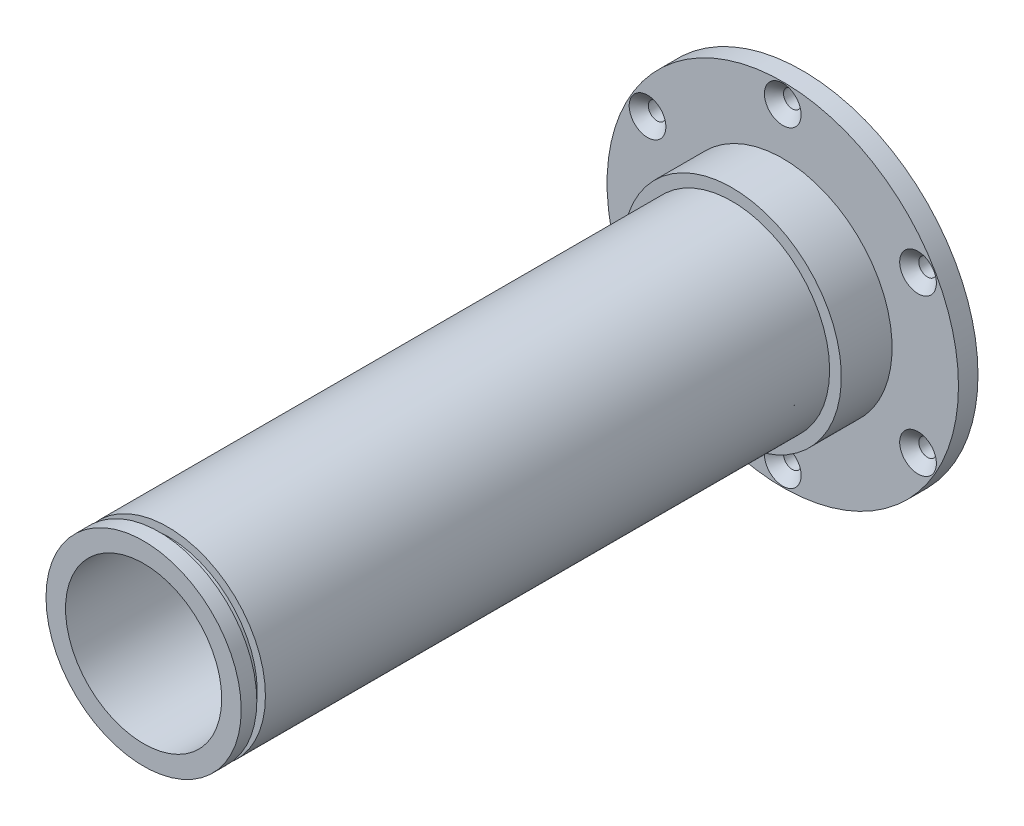
ISO-10303-21;
HEADER;
FILE_DESCRIPTION(('STEP AP214'),'2;1');
FILE_NAME('part.step','',(''),(''),'','','');
FILE_SCHEMA(('AUTOMOTIVE_DESIGN { 1 0 10303 214 1 1 1 1 }'));
ENDSEC;
DATA;
#1=APPLICATION_CONTEXT('core data for automotive mechanical design processes');
#2=APPLICATION_PROTOCOL_DEFINITION('international standard','automotive_design',2000,#1);
#3=PRODUCT_CONTEXT('',#1,'mechanical');
#4=PRODUCT('Part','Part','',(#3));
#5=PRODUCT_RELATED_PRODUCT_CATEGORY('part','',(#4));
#6=PRODUCT_DEFINITION_FORMATION('','',#4);
#7=PRODUCT_DEFINITION_CONTEXT('part definition',#1,'design');
#8=PRODUCT_DEFINITION('design','',#6,#7);
#9=PRODUCT_DEFINITION_SHAPE('','',#8);
#10=(LENGTH_UNIT() NAMED_UNIT(*) SI_UNIT(.MILLI.,.METRE.));
#11=(NAMED_UNIT(*) PLANE_ANGLE_UNIT() SI_UNIT($,.RADIAN.));
#12=(NAMED_UNIT(*) SI_UNIT($,.STERADIAN.) SOLID_ANGLE_UNIT());
#13=UNCERTAINTY_MEASURE_WITH_UNIT(LENGTH_MEASURE(1.E-05),#10,'distance_accuracy_value','');
#14=(GEOMETRIC_REPRESENTATION_CONTEXT(3) GLOBAL_UNCERTAINTY_ASSIGNED_CONTEXT((#13)) GLOBAL_UNIT_ASSIGNED_CONTEXT((#10,
#11,#12)) REPRESENTATION_CONTEXT('',''));
#15=CARTESIAN_POINT('',(0.,0.,0.));
#16=DIRECTION('',(0.,0.,1.));
#17=DIRECTION('',(1.,0.,0.));
#18=AXIS2_PLACEMENT_3D('',#15,#16,#17);
#19=CARTESIAN_POINT('',(0.,0.,0.));
#20=DIRECTION('',(0.,0.,1.));
#21=DIRECTION('',(1.,0.,0.));
#22=AXIS2_PLACEMENT_3D('',#19,#20,#21);
#23=PLANE('',#22);
#24=CARTESIAN_POINT('',(34.6410161513775,-20.,0.));
#25=DIRECTION('',(0.,0.,1.));
#26=DIRECTION('',(1.,0.,0.));
#27=AXIS2_PLACEMENT_3D('',#24,#25,#26);
#28=CIRCLE('',#27,2.25);
#29=CARTESIAN_POINT('',(36.8910161513775,-20.,0.));
#30=VERTEX_POINT('',#29);
#31=EDGE_CURVE('E34',#30,#30,#28,.T.);
#32=ORIENTED_EDGE('',*,*,#31,.T.);
#33=EDGE_LOOP('',(#32));
#34=FACE_BOUND('',#33,.T.);
#35=CARTESIAN_POINT('',(0.,-40.,0.));
#36=DIRECTION('',(0.,0.,1.));
#37=DIRECTION('',(1.,0.,0.));
#38=AXIS2_PLACEMENT_3D('',#35,#36,#37);
#39=CIRCLE('',#38,2.24999999999999);
#40=CARTESIAN_POINT('',(2.24999999999999,-40.,0.));
#41=VERTEX_POINT('',#40);
#42=EDGE_CURVE('E66',#41,#41,#39,.T.);
#43=ORIENTED_EDGE('',*,*,#42,.T.);
#44=EDGE_LOOP('',(#43));
#45=FACE_BOUND('',#44,.T.);
#46=CARTESIAN_POINT('',(-34.6410161513775,-20.,0.));
#47=DIRECTION('',(0.,0.,1.));
#48=DIRECTION('',(1.,0.,0.));
#49=AXIS2_PLACEMENT_3D('',#46,#47,#48);
#50=CIRCLE('',#49,2.24999999999999);
#51=CARTESIAN_POINT('',(-32.3910161513775,-20.,0.));
#52=VERTEX_POINT('',#51);
#53=EDGE_CURVE('E62',#52,#52,#50,.T.);
#54=ORIENTED_EDGE('',*,*,#53,.T.);
#55=EDGE_LOOP('',(#54));
#56=FACE_BOUND('',#55,.T.);
#57=CARTESIAN_POINT('',(-34.6410161513775,20.,0.));
#58=DIRECTION('',(0.,0.,1.));
#59=DIRECTION('',(1.,0.,0.));
#60=AXIS2_PLACEMENT_3D('',#57,#58,#59);
#61=CIRCLE('',#60,2.24999999999999);
#62=CARTESIAN_POINT('',(-32.3910161513775,20.,0.));
#63=VERTEX_POINT('',#62);
#64=EDGE_CURVE('E57',#63,#63,#61,.T.);
#65=ORIENTED_EDGE('',*,*,#64,.T.);
#66=EDGE_LOOP('',(#65));
#67=FACE_BOUND('',#66,.T.);
#68=CARTESIAN_POINT('',(0.,40.,0.));
#69=DIRECTION('',(0.,0.,1.));
#70=DIRECTION('',(1.,0.,0.));
#71=AXIS2_PLACEMENT_3D('',#68,#69,#70);
#72=CIRCLE('',#71,2.24999999999999);
#73=CARTESIAN_POINT('',(2.24999999999999,40.,0.));
#74=VERTEX_POINT('',#73);
#75=EDGE_CURVE('E52',#74,#74,#72,.T.);
#76=ORIENTED_EDGE('',*,*,#75,.T.);
#77=EDGE_LOOP('',(#76));
#78=FACE_BOUND('',#77,.T.);
#79=CARTESIAN_POINT('',(34.6410161513775,20.,0.));
#80=DIRECTION('',(0.,0.,1.));
#81=DIRECTION('',(1.,0.,0.));
#82=AXIS2_PLACEMENT_3D('',#79,#80,#81);
#83=CIRCLE('',#82,2.25);
#84=CARTESIAN_POINT('',(36.8910161513775,20.,0.));
#85=VERTEX_POINT('',#84);
#86=EDGE_CURVE('E47',#85,#85,#83,.T.);
#87=ORIENTED_EDGE('',*,*,#86,.T.);
#88=EDGE_LOOP('',(#87));
#89=FACE_BOUND('',#88,.T.);
#90=CARTESIAN_POINT('',(0.,0.,0.));
#91=DIRECTION('',(0.,0.,1.));
#92=DIRECTION('',(1.,0.,0.));
#93=AXIS2_PLACEMENT_3D('',#90,#91,#92);
#94=CIRCLE('',#93,45.);
#95=CARTESIAN_POINT('',(45.,0.,0.));
#96=VERTEX_POINT('',#95);
#97=EDGE_CURVE('E43',#96,#96,#94,.T.);
#98=ORIENTED_EDGE('',*,*,#97,.F.);
#99=EDGE_LOOP('',(#98));
#100=FACE_BOUND('',#99,.T.);
#101=CARTESIAN_POINT('',(0.,0.,0.));
#102=DIRECTION('',(0.,0.,1.));
#103=DIRECTION('',(1.,0.,0.));
#104=AXIS2_PLACEMENT_3D('',#101,#102,#103);
#105=CIRCLE('',#104,25.);
#106=CARTESIAN_POINT('',(25.,0.,0.));
#107=VERTEX_POINT('',#106);
#108=EDGE_CURVE('E10',#107,#107,#105,.F.);
#109=ORIENTED_EDGE('',*,*,#108,.F.);
#110=EDGE_LOOP('',(#109));
#111=FACE_BOUND('',#110,.T.);
#112=ADVANCED_FACE('F30',(#34,#45,#56,#67,#78,#89,#100,#111),#23,.F.);
#113=CARTESIAN_POINT('',(0.,0.,168.7));
#114=DIRECTION('',(0.,0.,-1.));
#115=DIRECTION('',(-1.,0.,0.));
#116=AXIS2_PLACEMENT_3D('',#113,#114,#115);
#117=CYLINDRICAL_SURFACE('',#116,25.);
#118=CARTESIAN_POINT('',(0.,0.,18.));
#119=DIRECTION('',(0.,0.,1.));
#120=DIRECTION('',(1.,0.,0.));
#121=AXIS2_PLACEMENT_3D('',#118,#119,#120);
#122=CIRCLE('',#121,25.);
#123=CARTESIAN_POINT('',(25.,0.,18.));
#124=VERTEX_POINT('',#123);
#125=EDGE_CURVE('E117',#124,#124,#122,.T.);
#126=ORIENTED_EDGE('',*,*,#125,.T.);
#127=EDGE_LOOP('',(#126));
#128=FACE_BOUND('',#127,.T.);
#129=CARTESIAN_POINT('',(0.,0.,162.5));
#130=DIRECTION('',(0.,0.,1.));
#131=DIRECTION('',(1.,0.,0.));
#132=AXIS2_PLACEMENT_3D('',#129,#130,#131);
#133=CIRCLE('',#132,25.);
#134=CARTESIAN_POINT('',(25.,0.,162.5));
#135=VERTEX_POINT('',#134);
#136=EDGE_CURVE('E109',#135,#135,#133,.T.);
#137=ORIENTED_EDGE('',*,*,#136,.F.);
#138=EDGE_LOOP('',(#137));
#139=FACE_BOUND('',#138,.T.);
#140=ADVANCED_FACE('F142',(#128,#139),#117,.T.);
#141=CARTESIAN_POINT('',(0.,0.,18.));
#142=DIRECTION('',(0.,0.,1.));
#143=DIRECTION('',(1.,0.,0.));
#144=AXIS2_PLACEMENT_3D('',#141,#142,#143);
#145=PLANE('',#144);
#146=CARTESIAN_POINT('',(0.,0.,18.));
#147=DIRECTION('',(0.,0.,1.));
#148=DIRECTION('',(1.,0.,0.));
#149=AXIS2_PLACEMENT_3D('',#146,#147,#148);
#150=CIRCLE('',#149,28.);
#151=CARTESIAN_POINT('',(-28.,0.,18.));
#152=VERTEX_POINT('',#151);
#153=EDGE_CURVE('E124',#152,#152,#150,.T.);
#154=ORIENTED_EDGE('',*,*,#153,.T.);
#155=EDGE_LOOP('',(#154));
#156=FACE_BOUND('',#155,.T.);
#157=ORIENTED_EDGE('',*,*,#125,.F.);
#158=EDGE_LOOP('',(#157));
#159=FACE_BOUND('',#158,.T.);
#160=ADVANCED_FACE('F134',(#156,#159),#145,.T.);
#161=CARTESIAN_POINT('',(0.,0.,5.));
#162=DIRECTION('',(0.,0.,1.));
#163=DIRECTION('',(1.,0.,0.));
#164=AXIS2_PLACEMENT_3D('',#161,#162,#163);
#165=PLANE('',#164);
#166=CARTESIAN_POINT('',(34.6410161513775,-20.,5.));
#167=DIRECTION('',(0.,0.,1.));
#168=DIRECTION('',(1.,0.,0.));
#169=AXIS2_PLACEMENT_3D('',#166,#167,#168);
#170=CIRCLE('',#169,4.7);
#171=CARTESIAN_POINT('',(39.3410161513775,-20.,5.));
#172=VERTEX_POINT('',#171);
#173=EDGE_CURVE('E385',#172,#172,#170,.T.);
#174=ORIENTED_EDGE('',*,*,#173,.F.);
#175=EDGE_LOOP('',(#174));
#176=FACE_BOUND('',#175,.T.);
#177=CARTESIAN_POINT('',(0.,-40.,5.));
#178=DIRECTION('',(0.,0.,1.));
#179=DIRECTION('',(1.,0.,0.));
#180=AXIS2_PLACEMENT_3D('',#177,#178,#179);
#181=CIRCLE('',#180,4.7);
#182=CARTESIAN_POINT('',(4.7,-40.,5.));
#183=VERTEX_POINT('',#182);
#184=EDGE_CURVE('E75',#183,#183,#181,.T.);
#185=ORIENTED_EDGE('',*,*,#184,.F.);
#186=EDGE_LOOP('',(#185));
#187=FACE_BOUND('',#186,.T.);
#188=CARTESIAN_POINT('',(-34.6410161513775,-20.,5.));
#189=DIRECTION('',(0.,0.,1.));
#190=DIRECTION('',(1.,0.,0.));
#191=AXIS2_PLACEMENT_3D('',#188,#189,#190);
#192=CIRCLE('',#191,4.7);
#193=CARTESIAN_POINT('',(-29.9410161513775,-20.,5.));
#194=VERTEX_POINT('',#193);
#195=EDGE_CURVE('E68',#194,#194,#192,.T.);
#196=ORIENTED_EDGE('',*,*,#195,.F.);
#197=EDGE_LOOP('',(#196));
#198=FACE_BOUND('',#197,.T.);
#199=CARTESIAN_POINT('',(-34.6410161513775,20.,5.));
#200=DIRECTION('',(0.,0.,1.));
#201=DIRECTION('',(1.,0.,0.));
#202=AXIS2_PLACEMENT_3D('',#199,#200,#201);
#203=CIRCLE('',#202,4.7);
#204=CARTESIAN_POINT('',(-29.9410161513775,20.,5.));
#205=VERTEX_POINT('',#204);
#206=EDGE_CURVE('E64',#205,#205,#203,.T.);
#207=ORIENTED_EDGE('',*,*,#206,.F.);
#208=EDGE_LOOP('',(#207));
#209=FACE_BOUND('',#208,.T.);
#210=CARTESIAN_POINT('',(0.,40.,5.));
#211=DIRECTION('',(0.,0.,1.));
#212=DIRECTION('',(1.,0.,0.));
#213=AXIS2_PLACEMENT_3D('',#210,#211,#212);
#214=CIRCLE('',#213,4.7);
#215=CARTESIAN_POINT('',(4.7,40.,5.));
#216=VERTEX_POINT('',#215);
#217=EDGE_CURVE('E60',#216,#216,#214,.T.);
#218=ORIENTED_EDGE('',*,*,#217,.F.);
#219=EDGE_LOOP('',(#218));
#220=FACE_BOUND('',#219,.T.);
#221=CARTESIAN_POINT('',(34.6410161513775,20.,5.));
#222=DIRECTION('',(0.,0.,1.));
#223=DIRECTION('',(1.,0.,0.));
#224=AXIS2_PLACEMENT_3D('',#221,#222,#223);
#225=CIRCLE('',#224,4.7);
#226=CARTESIAN_POINT('',(39.3410161513775,20.,5.));
#227=VERTEX_POINT('',#226);
#228=EDGE_CURVE('E55',#227,#227,#225,.T.);
#229=ORIENTED_EDGE('',*,*,#228,.F.);
#230=EDGE_LOOP('',(#229));
#231=FACE_BOUND('',#230,.T.);
#232=CARTESIAN_POINT('',(0.,0.,5.));
#233=DIRECTION('',(0.,0.,1.));
#234=DIRECTION('',(1.,0.,0.));
#235=AXIS2_PLACEMENT_3D('',#232,#233,#234);
#236=CIRCLE('',#235,45.);
#237=CARTESIAN_POINT('',(45.,0.,5.));
#238=VERTEX_POINT('',#237);
#239=EDGE_CURVE('E38',#238,#238,#236,.T.);
#240=ORIENTED_EDGE('',*,*,#239,.T.);
#241=EDGE_LOOP('',(#240));
#242=FACE_BOUND('',#241,.T.);
#243=CARTESIAN_POINT('',(0.,0.,5.));
#244=DIRECTION('',(0.,0.,1.));
#245=DIRECTION('',(1.,0.,0.));
#246=AXIS2_PLACEMENT_3D('',#243,#244,#245);
#247=CIRCLE('',#246,28.);
#248=CARTESIAN_POINT('',(-28.,0.,5.));
#249=VERTEX_POINT('',#248);
#250=EDGE_CURVE('E121',#249,#249,#247,.T.);
#251=ORIENTED_EDGE('',*,*,#250,.F.);
#252=EDGE_LOOP('',(#251));
#253=FACE_BOUND('',#252,.T.);
#254=ADVANCED_FACE('F132',(#176,#187,#198,#209,#220,#231,#242,#253),#165,.T.);
#255=CARTESIAN_POINT('',(0.,0.,5.));
#256=DIRECTION('',(0.,0.,-1.));
#257=DIRECTION('',(-1.,0.,0.));
#258=AXIS2_PLACEMENT_3D('',#255,#256,#257);
#259=CYLINDRICAL_SURFACE('',#258,45.);
#260=ORIENTED_EDGE('',*,*,#239,.F.);
#261=EDGE_LOOP('',(#260));
#262=FACE_BOUND('',#261,.T.);
#263=ORIENTED_EDGE('',*,*,#97,.T.);
#264=EDGE_LOOP('',(#263));
#265=FACE_BOUND('',#264,.T.);
#266=ADVANCED_FACE('F32',(#262,#265),#259,.T.);
#267=CARTESIAN_POINT('',(0.,0.,18.));
#268=DIRECTION('',(0.,0.,-1.));
#269=DIRECTION('',(-1.,0.,0.));
#270=AXIS2_PLACEMENT_3D('',#267,#268,#269);
#271=CYLINDRICAL_SURFACE('',#270,28.);
#272=CARTESIAN_POINT('',(-28.,0.,18.));
#273=CARTESIAN_POINT('',(-28.,0.,17.8645833333333));
#274=CARTESIAN_POINT('',(-28.,0.,17.7291666666667));
#275=CARTESIAN_POINT('',(-28.,0.,17.4583333333333));
#276=CARTESIAN_POINT('',(-28.,0.,17.3229166666667));
#277=CARTESIAN_POINT('',(-28.,0.,17.0520833333333));
#278=CARTESIAN_POINT('',(-28.,0.,16.9166666666667));
#279=CARTESIAN_POINT('',(-28.,0.,16.6458333333333));
#280=CARTESIAN_POINT('',(-28.,0.,16.5104166666667));
#281=CARTESIAN_POINT('',(-28.,0.,16.2395833333333));
#282=CARTESIAN_POINT('',(-28.,0.,16.1041666666667));
#283=CARTESIAN_POINT('',(-28.,0.,15.8333333333333));
#284=CARTESIAN_POINT('',(-28.,0.,15.6979166666667));
#285=CARTESIAN_POINT('',(-28.,0.,15.4270833333333));
#286=CARTESIAN_POINT('',(-28.,0.,15.2916666666667));
#287=CARTESIAN_POINT('',(-28.,0.,15.0208333333333));
#288=CARTESIAN_POINT('',(-28.,0.,14.8854166666667));
#289=CARTESIAN_POINT('',(-28.,0.,14.6145833333333));
#290=CARTESIAN_POINT('',(-28.,0.,14.4791666666667));
#291=CARTESIAN_POINT('',(-28.,0.,14.2083333333333));
#292=CARTESIAN_POINT('',(-28.,0.,14.0729166666667));
#293=CARTESIAN_POINT('',(-28.,0.,13.8020833333333));
#294=CARTESIAN_POINT('',(-28.,0.,13.6666666666667));
#295=CARTESIAN_POINT('',(-28.,0.,13.3958333333333));
#296=CARTESIAN_POINT('',(-28.,0.,13.2604166666667));
#297=CARTESIAN_POINT('',(-28.,0.,12.9895833333333));
#298=CARTESIAN_POINT('',(-28.,0.,12.8541666666667));
#299=CARTESIAN_POINT('',(-28.,0.,12.5833333333333));
#300=CARTESIAN_POINT('',(-28.,0.,12.4479166666667));
#301=CARTESIAN_POINT('',(-28.,0.,12.1770833333333));
#302=CARTESIAN_POINT('',(-28.,0.,12.0416666666667));
#303=CARTESIAN_POINT('',(-28.,0.,11.7708333333333));
#304=CARTESIAN_POINT('',(-28.,0.,11.6354166666667));
#305=CARTESIAN_POINT('',(-28.,0.,11.3645833333333));
#306=CARTESIAN_POINT('',(-28.,0.,11.2291666666667));
#307=CARTESIAN_POINT('',(-28.,0.,10.9583333333333));
#308=CARTESIAN_POINT('',(-28.,0.,10.8229166666667));
#309=CARTESIAN_POINT('',(-28.,0.,10.5520833333333));
#310=CARTESIAN_POINT('',(-28.,0.,10.4166666666667));
#311=CARTESIAN_POINT('',(-28.,0.,10.1458333333333));
#312=CARTESIAN_POINT('',(-28.,0.,10.0104166666667));
#313=CARTESIAN_POINT('',(-28.,0.,9.73958333333333));
#314=CARTESIAN_POINT('',(-28.,0.,9.60416666666667));
#315=CARTESIAN_POINT('',(-28.,0.,9.33333333333333));
#316=CARTESIAN_POINT('',(-28.,0.,9.19791666666667));
#317=CARTESIAN_POINT('',(-28.,0.,8.92708333333333));
#318=CARTESIAN_POINT('',(-28.,0.,8.79166666666667));
#319=CARTESIAN_POINT('',(-28.,0.,8.52083333333333));
#320=CARTESIAN_POINT('',(-28.,0.,8.38541666666667));
#321=CARTESIAN_POINT('',(-28.,0.,8.11458333333333));
#322=CARTESIAN_POINT('',(-28.,0.,7.97916666666667));
#323=CARTESIAN_POINT('',(-28.,0.,7.70833333333333));
#324=CARTESIAN_POINT('',(-28.,0.,7.57291666666667));
#325=CARTESIAN_POINT('',(-28.,0.,7.30208333333333));
#326=CARTESIAN_POINT('',(-28.,0.,7.16666666666667));
#327=CARTESIAN_POINT('',(-28.,0.,6.89583333333333));
#328=CARTESIAN_POINT('',(-28.,0.,6.76041666666667));
#329=CARTESIAN_POINT('',(-28.,0.,6.48958333333333));
#330=CARTESIAN_POINT('',(-28.,0.,6.35416666666667));
#331=CARTESIAN_POINT('',(-28.,0.,6.08333333333333));
#332=CARTESIAN_POINT('',(-28.,0.,5.94791666666667));
#333=CARTESIAN_POINT('',(-28.,0.,5.67708333333333));
#334=CARTESIAN_POINT('',(-28.,0.,5.54166666666667));
#335=CARTESIAN_POINT('',(-28.,0.,5.27083333333333));
#336=CARTESIAN_POINT('',(-28.,0.,5.13541666666667));
#337=CARTESIAN_POINT('',(-28.,0.,5.));
#338=B_SPLINE_CURVE_WITH_KNOTS('',3,(#272,#273,#274,#275,#276,#277,#278,#279,#280,#281,#282,
#283,#284,#285,#286,#287,#288,#289,#290,#291,#292,#293,#294,#295,#296,#297,#298,#299,#300,#301,
#302,#303,#304,#305,#306,#307,#308,#309,#310,#311,#312,#313,#314,#315,#316,#317,#318,#319,#320,
#321,#322,#323,#324,#325,#326,#327,#328,#329,#330,#331,#332,#333,#334,#335,#336,#337),
.UNSPECIFIED.,.F.,.F.,(4,2,2,2,2,2,2,2,2,2,2,2,2,2,2,2,2,2,2,2,2,2,2,2,2,2,2,2,2,2,2,2,4),(0.,
0.40625,0.812500000000001,1.21875,1.625,2.03125,2.4375,2.84375,3.25,3.65625,4.0625,4.46875,
4.875,5.28125,5.6875,6.09375,6.5,6.90625,7.3125,7.71875,8.125,8.53125,8.9375,9.34375,9.75,
10.15625,10.5625,10.96875,11.375,11.78125,12.1875,12.59375,13.),.UNSPECIFIED.);
#339=EDGE_CURVE('BSEAM130',#152,#249,#338,.T.);
#340=ORIENTED_EDGE('',*,*,#153,.F.);
#341=ORIENTED_EDGE('',*,*,#250,.T.);
#342=ORIENTED_EDGE('',*,*,#339,.T.);
#343=ORIENTED_EDGE('',*,*,#339,.F.);
#344=EDGE_LOOP('',(#340,#342,#341,#343));
#345=FACE_BOUND('',#344,.T.);
#346=ADVANCED_FACE('F130',(#345),#271,.T.);
#347=CARTESIAN_POINT('',(0.,0.,164.7));
#348=DIRECTION('',(0.,0.,1.));
#349=DIRECTION('',(1.,0.,0.));
#350=AXIS2_PLACEMENT_3D('',#347,#348,#349);
#351=CIRCLE('',#350,25.);
#352=CARTESIAN_POINT('',(25.,0.,164.7));
#353=VERTEX_POINT('',#352);
#354=EDGE_CURVE('E106',#353,#353,#351,.T.);
#355=ORIENTED_EDGE('',*,*,#354,.T.);
#356=EDGE_LOOP('',(#355));
#357=FACE_BOUND('',#356,.T.);
#358=CARTESIAN_POINT('',(0.,0.,168.7));
#359=DIRECTION('',(0.,0.,1.));
#360=DIRECTION('',(1.,0.,0.));
#361=AXIS2_PLACEMENT_3D('',#358,#359,#360);
#362=CIRCLE('',#361,25.);
#363=CARTESIAN_POINT('',(25.,0.,168.7));
#364=VERTEX_POINT('',#363);
#365=EDGE_CURVE('E118',#364,#364,#362,.T.);
#366=ORIENTED_EDGE('',*,*,#365,.F.);
#367=EDGE_LOOP('',(#366));
#368=FACE_BOUND('',#367,.T.);
#369=ADVANCED_FACE('F155',(#357,#368),#117,.T.);
#370=CARTESIAN_POINT('',(0.,0.,168.7));
#371=DIRECTION('',(0.,0.,1.));
#372=DIRECTION('',(1.,0.,0.));
#373=AXIS2_PLACEMENT_3D('',#370,#371,#372);
#374=PLANE('',#373);
#375=CARTESIAN_POINT('',(0.,0.,168.7));
#376=DIRECTION('',(0.,0.,1.));
#377=DIRECTION('',(1.,0.,0.));
#378=AXIS2_PLACEMENT_3D('',#375,#376,#377);
#379=CIRCLE('',#378,20.);
#380=CARTESIAN_POINT('',(20.,0.,168.7));
#381=VERTEX_POINT('',#380);
#382=EDGE_CURVE('E112',#381,#381,#379,.T.);
#383=ORIENTED_EDGE('',*,*,#382,.F.);
#384=EDGE_LOOP('',(#383));
#385=FACE_BOUND('',#384,.T.);
#386=ORIENTED_EDGE('',*,*,#365,.T.);
#387=EDGE_LOOP('',(#386));
#388=FACE_BOUND('',#387,.T.);
#389=ADVANCED_FACE('F208',(#385,#388),#374,.T.);
#390=CARTESIAN_POINT('',(0.,0.,-31.3));
#391=DIRECTION('',(0.,0.,1.));
#392=DIRECTION('',(1.,0.,0.));
#393=AXIS2_PLACEMENT_3D('',#390,#391,#392);
#394=CYLINDRICAL_SURFACE('',#393,20.);
#395=ORIENTED_EDGE('',*,*,#382,.T.);
#396=EDGE_LOOP('',(#395));
#397=FACE_BOUND('',#396,.T.);
#398=CARTESIAN_POINT('',(0.,0.,-3.));
#399=DIRECTION('',(0.,0.,-1.));
#400=DIRECTION('',(-1.,0.,0.));
#401=AXIS2_PLACEMENT_3D('',#398,#399,#400);
#402=CIRCLE('',#401,20.);
#403=CARTESIAN_POINT('',(-20.,0.,-3.));
#404=VERTEX_POINT('',#403);
#405=EDGE_CURVE('E50',#404,#404,#402,.T.);
#406=ORIENTED_EDGE('',*,*,#405,.T.);
#407=EDGE_LOOP('',(#406));
#408=FACE_BOUND('',#407,.T.);
#409=ADVANCED_FACE('F201',(#397,#408),#394,.F.);
#410=CARTESIAN_POINT('',(0.,0.,162.5));
#411=DIRECTION('',(0.,0.,1.));
#412=DIRECTION('',(1.,0.,0.));
#413=AXIS2_PLACEMENT_3D('',#410,#411,#412);
#414=PLANE('',#413);
#415=CARTESIAN_POINT('',(0.,0.,162.5));
#416=DIRECTION('',(0.,0.,1.));
#417=DIRECTION('',(1.,0.,0.));
#418=AXIS2_PLACEMENT_3D('',#415,#416,#417);
#419=CIRCLE('',#418,22.9);
#420=CARTESIAN_POINT('',(22.9,0.,162.5));
#421=VERTEX_POINT('',#420);
#422=EDGE_CURVE('E103',#421,#421,#419,.T.);
#423=ORIENTED_EDGE('',*,*,#422,.F.);
#424=EDGE_LOOP('',(#423));
#425=FACE_BOUND('',#424,.T.);
#426=ORIENTED_EDGE('',*,*,#136,.T.);
#427=EDGE_LOOP('',(#426));
#428=FACE_BOUND('',#427,.T.);
#429=ADVANCED_FACE('F198',(#425,#428),#414,.T.);
#430=CARTESIAN_POINT('',(0.,0.,164.7));
#431=DIRECTION('',(0.,0.,1.));
#432=DIRECTION('',(1.,0.,0.));
#433=AXIS2_PLACEMENT_3D('',#430,#431,#432);
#434=PLANE('',#433);
#435=CARTESIAN_POINT('',(0.,0.,164.7));
#436=DIRECTION('',(0.,0.,1.));
#437=DIRECTION('',(1.,0.,0.));
#438=AXIS2_PLACEMENT_3D('',#435,#436,#437);
#439=CIRCLE('',#438,22.9);
#440=CARTESIAN_POINT('',(22.9,0.,164.7));
#441=VERTEX_POINT('',#440);
#442=EDGE_CURVE('E102',#441,#441,#439,.T.);
#443=ORIENTED_EDGE('',*,*,#442,.T.);
#444=EDGE_LOOP('',(#443));
#445=FACE_BOUND('',#444,.T.);
#446=ORIENTED_EDGE('',*,*,#354,.F.);
#447=EDGE_LOOP('',(#446));
#448=FACE_BOUND('',#447,.T.);
#449=ADVANCED_FACE('F196',(#445,#448),#434,.F.);
#450=CARTESIAN_POINT('',(0.,0.,162.5));
#451=DIRECTION('',(0.,0.,1.));
#452=DIRECTION('',(1.,0.,0.));
#453=AXIS2_PLACEMENT_3D('',#450,#451,#452);
#454=CYLINDRICAL_SURFACE('',#453,22.9);
#455=ORIENTED_EDGE('',*,*,#422,.T.);
#456=EDGE_LOOP('',(#455));
#457=FACE_BOUND('',#456,.T.);
#458=ORIENTED_EDGE('',*,*,#442,.F.);
#459=EDGE_LOOP('',(#458));
#460=FACE_BOUND('',#459,.T.);
#461=ADVANCED_FACE('F191',(#457,#460),#454,.T.);
#462=CARTESIAN_POINT('',(0.,0.,-3.));
#463=DIRECTION('',(0.,0.,-1.));
#464=DIRECTION('',(-1.,0.,0.));
#465=AXIS2_PLACEMENT_3D('',#462,#463,#464);
#466=PLANE('',#465);
#467=CARTESIAN_POINT('',(0.,0.,-3.));
#468=DIRECTION('',(0.,0.,-1.));
#469=DIRECTION('',(-1.,0.,0.));
#470=AXIS2_PLACEMENT_3D('',#467,#468,#469);
#471=CIRCLE('',#470,25.);
#472=CARTESIAN_POINT('',(-25.,0.,-3.));
#473=VERTEX_POINT('',#472);
#474=EDGE_CURVE('E99',#473,#473,#471,.T.);
#475=ORIENTED_EDGE('',*,*,#474,.T.);
#476=EDGE_LOOP('',(#475));
#477=FACE_BOUND('',#476,.T.);
#478=ORIENTED_EDGE('',*,*,#405,.F.);
#479=EDGE_LOOP('',(#478));
#480=FACE_BOUND('',#479,.T.);
#481=ADVANCED_FACE('F185',(#477,#480),#466,.T.);
#482=CARTESIAN_POINT('',(0.,0.,-3.));
#483=DIRECTION('',(0.,0.,1.));
#484=DIRECTION('',(1.,0.,0.));
#485=AXIS2_PLACEMENT_3D('',#482,#483,#484);
#486=CYLINDRICAL_SURFACE('',#485,25.);
#487=ORIENTED_EDGE('',*,*,#474,.F.);
#488=EDGE_LOOP('',(#487));
#489=FACE_BOUND('',#488,.T.);
#490=ORIENTED_EDGE('',*,*,#108,.T.);
#491=EDGE_LOOP('',(#490));
#492=FACE_BOUND('',#491,.T.);
#493=ADVANCED_FACE('F175',(#489,#492),#486,.T.);
#494=CARTESIAN_POINT('',(34.6410161513775,20.,5.));
#495=DIRECTION('',(0.,0.,1.));
#496=DIRECTION('',(1.,0.,0.));
#497=AXIS2_PLACEMENT_3D('',#494,#495,#496);
#498=CYLINDRICAL_SURFACE('',#497,2.25);
#499=CARTESIAN_POINT('',(34.6410161513775,20.,2.54999999999999));
#500=DIRECTION('',(0.,0.,1.));
#501=DIRECTION('',(1.,0.,0.));
#502=AXIS2_PLACEMENT_3D('',#499,#500,#501);
#503=CIRCLE('',#502,2.24999999999999);
#504=CARTESIAN_POINT('',(36.8910161513775,20.,2.54999999999999));
#505=VERTEX_POINT('',#504);
#506=EDGE_CURVE('E51',#505,#505,#503,.T.);
#507=ORIENTED_EDGE('',*,*,#506,.T.);
#508=EDGE_LOOP('',(#507));
#509=FACE_BOUND('',#508,.T.);
#510=ORIENTED_EDGE('',*,*,#86,.F.);
#511=EDGE_LOOP('',(#510));
#512=FACE_BOUND('',#511,.T.);
#513=ADVANCED_FACE('F172',(#509,#512),#498,.F.);
#514=CARTESIAN_POINT('',(34.6410161513775,20.,5.));
#515=DIRECTION('',(0.,0.,1.));
#516=DIRECTION('',(1.,0.,0.));
#517=AXIS2_PLACEMENT_3D('',#514,#515,#516);
#518=CONICAL_SURFACE('',#517,4.7,0.785398163397448);
#519=ORIENTED_EDGE('',*,*,#506,.F.);
#520=EDGE_LOOP('',(#519));
#521=FACE_BOUND('',#520,.T.);
#522=ORIENTED_EDGE('',*,*,#228,.T.);
#523=EDGE_LOOP('',(#522));
#524=FACE_BOUND('',#523,.T.);
#525=ADVANCED_FACE('F174',(#521,#524),#518,.F.);
#526=CARTESIAN_POINT('',(0.,40.,5.));
#527=DIRECTION('',(0.,0.,1.));
#528=DIRECTION('',(1.,0.,0.));
#529=AXIS2_PLACEMENT_3D('',#526,#527,#528);
#530=CYLINDRICAL_SURFACE('',#529,2.24999999999999);
#531=CARTESIAN_POINT('',(0.,40.,2.54999999999999));
#532=DIRECTION('',(0.,0.,1.));
#533=DIRECTION('',(1.,0.,0.));
#534=AXIS2_PLACEMENT_3D('',#531,#532,#533);
#535=CIRCLE('',#534,2.24999999999999);
#536=CARTESIAN_POINT('',(2.24999999999999,40.,2.54999999999999));
#537=VERTEX_POINT('',#536);
#538=EDGE_CURVE('E56',#537,#537,#535,.T.);
#539=ORIENTED_EDGE('',*,*,#538,.T.);
#540=EDGE_LOOP('',(#539));
#541=FACE_BOUND('',#540,.T.);
#542=ORIENTED_EDGE('',*,*,#75,.F.);
#543=EDGE_LOOP('',(#542));
#544=FACE_BOUND('',#543,.T.);
#545=ADVANCED_FACE('F182',(#541,#544),#530,.F.);
#546=CARTESIAN_POINT('',(0.,40.,5.));
#547=DIRECTION('',(0.,0.,1.));
#548=DIRECTION('',(1.,0.,0.));
#549=AXIS2_PLACEMENT_3D('',#546,#547,#548);
#550=CONICAL_SURFACE('',#549,4.7,0.785398163397449);
#551=ORIENTED_EDGE('',*,*,#538,.F.);
#552=EDGE_LOOP('',(#551));
#553=FACE_BOUND('',#552,.T.);
#554=ORIENTED_EDGE('',*,*,#217,.T.);
#555=EDGE_LOOP('',(#554));
#556=FACE_BOUND('',#555,.T.);
#557=ADVANCED_FACE('F288',(#553,#556),#550,.F.);
#558=CARTESIAN_POINT('',(-34.6410161513775,20.,5.));
#559=DIRECTION('',(0.,0.,1.));
#560=DIRECTION('',(1.,0.,0.));
#561=AXIS2_PLACEMENT_3D('',#558,#559,#560);
#562=CYLINDRICAL_SURFACE('',#561,2.24999999999999);
#563=CARTESIAN_POINT('',(-34.6410161513775,20.,2.54999999999999));
#564=DIRECTION('',(0.,0.,1.));
#565=DIRECTION('',(1.,0.,0.));
#566=AXIS2_PLACEMENT_3D('',#563,#564,#565);
#567=CIRCLE('',#566,2.24999999999999);
#568=CARTESIAN_POINT('',(-32.3910161513775,20.,2.54999999999999));
#569=VERTEX_POINT('',#568);
#570=EDGE_CURVE('E61',#569,#569,#567,.T.);
#571=ORIENTED_EDGE('',*,*,#570,.T.);
#572=EDGE_LOOP('',(#571));
#573=FACE_BOUND('',#572,.T.);
#574=ORIENTED_EDGE('',*,*,#64,.F.);
#575=EDGE_LOOP('',(#574));
#576=FACE_BOUND('',#575,.T.);
#577=ADVANCED_FACE('F297',(#573,#576),#562,.F.);
#578=CARTESIAN_POINT('',(-34.6410161513775,20.,5.));
#579=DIRECTION('',(0.,0.,1.));
#580=DIRECTION('',(1.,0.,0.));
#581=AXIS2_PLACEMENT_3D('',#578,#579,#580);
#582=CONICAL_SURFACE('',#581,4.7,0.785398163397449);
#583=ORIENTED_EDGE('',*,*,#570,.F.);
#584=EDGE_LOOP('',(#583));
#585=FACE_BOUND('',#584,.T.);
#586=ORIENTED_EDGE('',*,*,#206,.T.);
#587=EDGE_LOOP('',(#586));
#588=FACE_BOUND('',#587,.T.);
#589=ADVANCED_FACE('F307',(#585,#588),#582,.F.);
#590=CARTESIAN_POINT('',(-34.6410161513775,-20.,5.));
#591=DIRECTION('',(0.,0.,1.));
#592=DIRECTION('',(1.,0.,0.));
#593=AXIS2_PLACEMENT_3D('',#590,#591,#592);
#594=CYLINDRICAL_SURFACE('',#593,2.24999999999999);
#595=CARTESIAN_POINT('',(-34.6410161513775,-20.,2.54999999999999));
#596=DIRECTION('',(0.,0.,1.));
#597=DIRECTION('',(1.,0.,0.));
#598=AXIS2_PLACEMENT_3D('',#595,#596,#597);
#599=CIRCLE('',#598,2.24999999999999);
#600=CARTESIAN_POINT('',(-32.3910161513775,-20.,2.54999999999999));
#601=VERTEX_POINT('',#600);
#602=EDGE_CURVE('E65',#601,#601,#599,.T.);
#603=ORIENTED_EDGE('',*,*,#602,.T.);
#604=EDGE_LOOP('',(#603));
#605=FACE_BOUND('',#604,.T.);
#606=ORIENTED_EDGE('',*,*,#53,.F.);
#607=EDGE_LOOP('',(#606));
#608=FACE_BOUND('',#607,.T.);
#609=ADVANCED_FACE('F317',(#605,#608),#594,.F.);
#610=CARTESIAN_POINT('',(-34.6410161513775,-20.,5.));
#611=DIRECTION('',(0.,0.,1.));
#612=DIRECTION('',(1.,0.,0.));
#613=AXIS2_PLACEMENT_3D('',#610,#611,#612);
#614=CONICAL_SURFACE('',#613,4.7,0.785398163397449);
#615=ORIENTED_EDGE('',*,*,#602,.F.);
#616=EDGE_LOOP('',(#615));
#617=FACE_BOUND('',#616,.T.);
#618=ORIENTED_EDGE('',*,*,#195,.T.);
#619=EDGE_LOOP('',(#618));
#620=FACE_BOUND('',#619,.T.);
#621=ADVANCED_FACE('F327',(#617,#620),#614,.F.);
#622=CARTESIAN_POINT('',(0.,-40.,5.));
#623=DIRECTION('',(0.,0.,1.));
#624=DIRECTION('',(1.,0.,0.));
#625=AXIS2_PLACEMENT_3D('',#622,#623,#624);
#626=CYLINDRICAL_SURFACE('',#625,2.24999999999999);
#627=CARTESIAN_POINT('',(0.,-40.,2.54999999999999));
#628=DIRECTION('',(0.,0.,1.));
#629=DIRECTION('',(1.,0.,0.));
#630=AXIS2_PLACEMENT_3D('',#627,#628,#629);
#631=CIRCLE('',#630,2.24999999999999);
#632=CARTESIAN_POINT('',(2.24999999999999,-40.,2.54999999999999));
#633=VERTEX_POINT('',#632);
#634=EDGE_CURVE('E69',#633,#633,#631,.T.);
#635=ORIENTED_EDGE('',*,*,#634,.T.);
#636=EDGE_LOOP('',(#635));
#637=FACE_BOUND('',#636,.T.);
#638=ORIENTED_EDGE('',*,*,#42,.F.);
#639=EDGE_LOOP('',(#638));
#640=FACE_BOUND('',#639,.T.);
#641=ADVANCED_FACE('F337',(#637,#640),#626,.F.);
#642=CARTESIAN_POINT('',(0.,-40.,5.));
#643=DIRECTION('',(0.,0.,1.));
#644=DIRECTION('',(1.,0.,0.));
#645=AXIS2_PLACEMENT_3D('',#642,#643,#644);
#646=CONICAL_SURFACE('',#645,4.7,0.785398163397449);
#647=ORIENTED_EDGE('',*,*,#634,.F.);
#648=EDGE_LOOP('',(#647));
#649=FACE_BOUND('',#648,.T.);
#650=ORIENTED_EDGE('',*,*,#184,.T.);
#651=EDGE_LOOP('',(#650));
#652=FACE_BOUND('',#651,.T.);
#653=ADVANCED_FACE('F347',(#649,#652),#646,.F.);
#654=CARTESIAN_POINT('',(34.6410161513775,-20.,5.));
#655=DIRECTION('',(0.,0.,1.));
#656=DIRECTION('',(1.,0.,0.));
#657=AXIS2_PLACEMENT_3D('',#654,#655,#656);
#658=CYLINDRICAL_SURFACE('',#657,2.25);
#659=CARTESIAN_POINT('',(34.6410161513775,-20.,2.54999999999999));
#660=DIRECTION('',(0.,0.,1.));
#661=DIRECTION('',(1.,0.,0.));
#662=AXIS2_PLACEMENT_3D('',#659,#660,#661);
#663=CIRCLE('',#662,2.24999999999999);
#664=CARTESIAN_POINT('',(36.8910161513775,-20.,2.54999999999999));
#665=VERTEX_POINT('',#664);
#666=EDGE_CURVE('E383',#665,#665,#663,.T.);
#667=ORIENTED_EDGE('',*,*,#666,.T.);
#668=EDGE_LOOP('',(#667));
#669=FACE_BOUND('',#668,.T.);
#670=ORIENTED_EDGE('',*,*,#31,.F.);
#671=EDGE_LOOP('',(#670));
#672=FACE_BOUND('',#671,.T.);
#673=ADVANCED_FACE('F356',(#669,#672),#658,.F.);
#674=CARTESIAN_POINT('',(34.6410161513775,-20.,5.));
#675=DIRECTION('',(0.,0.,1.));
#676=DIRECTION('',(1.,0.,0.));
#677=AXIS2_PLACEMENT_3D('',#674,#675,#676);
#678=CONICAL_SURFACE('',#677,4.7,0.785398163397448);
#679=ORIENTED_EDGE('',*,*,#666,.F.);
#680=EDGE_LOOP('',(#679));
#681=FACE_BOUND('',#680,.T.);
#682=ORIENTED_EDGE('',*,*,#173,.T.);
#683=EDGE_LOOP('',(#682));
#684=FACE_BOUND('',#683,.T.);
#685=ADVANCED_FACE('F366',(#681,#684),#678,.F.);
#686=CLOSED_SHELL('',(#112,#140,#160,#254,#266,#346,#369,#389,#409,#429,#449,#461,#481,#493,
#513,#525,#545,#557,#577,#589,#609,#621,#641,#653,#673,#685));
#687=MANIFOLD_SOLID_BREP('B2',#686);
#688=ADVANCED_BREP_SHAPE_REPRESENTATION('',(#18,#687),#14);
#689=SHAPE_DEFINITION_REPRESENTATION(#9,#688);
ENDSEC;
END-ISO-10303-21;
